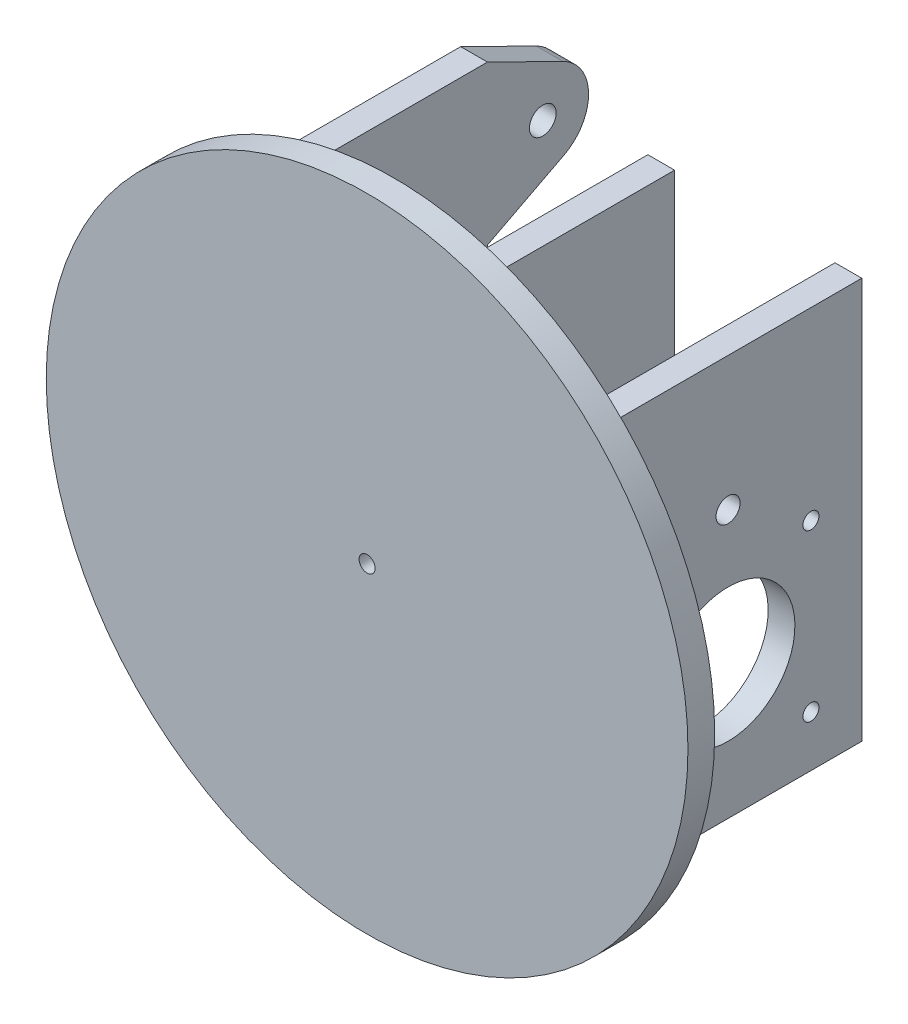
ISO-10303-21;
HEADER;
FILE_DESCRIPTION(('STEP AP214'),'2;1');
FILE_NAME('part.step','',(''),(''),'','','');
FILE_SCHEMA(('AUTOMOTIVE_DESIGN { 1 0 10303 214 1 1 1 1 }'));
ENDSEC;
DATA;
#1=APPLICATION_CONTEXT('core data for automotive mechanical design processes');
#2=APPLICATION_PROTOCOL_DEFINITION('international standard','automotive_design',2000,#1);
#3=PRODUCT_CONTEXT('',#1,'mechanical');
#4=PRODUCT('Part','Part','',(#3));
#5=PRODUCT_RELATED_PRODUCT_CATEGORY('part','',(#4));
#6=PRODUCT_DEFINITION_FORMATION('','',#4);
#7=PRODUCT_DEFINITION_CONTEXT('part definition',#1,'design');
#8=PRODUCT_DEFINITION('design','',#6,#7);
#9=PRODUCT_DEFINITION_SHAPE('','',#8);
#10=(LENGTH_UNIT() NAMED_UNIT(*) SI_UNIT(.MILLI.,.METRE.));
#11=(NAMED_UNIT(*) PLANE_ANGLE_UNIT() SI_UNIT($,.RADIAN.));
#12=(NAMED_UNIT(*) SI_UNIT($,.STERADIAN.) SOLID_ANGLE_UNIT());
#13=UNCERTAINTY_MEASURE_WITH_UNIT(LENGTH_MEASURE(1.E-05),#10,'distance_accuracy_value','');
#14=(GEOMETRIC_REPRESENTATION_CONTEXT(3) GLOBAL_UNCERTAINTY_ASSIGNED_CONTEXT((#13)) GLOBAL_UNIT_ASSIGNED_CONTEXT((#10,
#11,#12)) REPRESENTATION_CONTEXT('',''));
#15=CARTESIAN_POINT('',(0.,0.,0.));
#16=DIRECTION('',(0.,0.,1.));
#17=DIRECTION('',(1.,0.,0.));
#18=AXIS2_PLACEMENT_3D('',#15,#16,#17);
#19=CARTESIAN_POINT('',(0.,0.,-50.));
#20=DIRECTION('',(0.,0.,1.));
#21=DIRECTION('',(1.,0.,0.));
#22=AXIS2_PLACEMENT_3D('',#19,#20,#21);
#23=PLANE('',#22);
#24=DIRECTION('',(-1.,0.,0.));
#25=VECTOR('',#24,1.);
#26=CARTESIAN_POINT('',(-32.5,7.85533905932757,-50.));
#27=LINE('',#26,#25);
#28=CARTESIAN_POINT('',(-32.5,7.85533905932757,-50.));
#29=VERTEX_POINT('',#28);
#30=CARTESIAN_POINT('',(-37.5,7.85533905932756,-50.));
#31=VERTEX_POINT('',#30);
#32=EDGE_CURVE('E57',#29,#31,#27,.T.);
#33=ORIENTED_EDGE('',*,*,#32,.F.);
#34=DIRECTION('',(0.,-1.,0.));
#35=VECTOR('',#34,1.);
#36=CARTESIAN_POINT('',(-32.5,37.5,-50.));
#37=LINE('',#36,#35);
#38=CARTESIAN_POINT('',(-32.5,-37.5,-50.));
#39=VERTEX_POINT('',#38);
#40=EDGE_CURVE('E170',#29,#39,#37,.T.);
#41=ORIENTED_EDGE('',*,*,#40,.T.);
#42=DIRECTION('',(-1.,0.,0.));
#43=VECTOR('',#42,1.);
#44=CARTESIAN_POINT('',(-37.5,-37.5,-50.));
#45=LINE('',#44,#43);
#46=CARTESIAN_POINT('',(-37.5,-37.5,-50.));
#47=VERTEX_POINT('',#46);
#48=EDGE_CURVE('E322',#39,#47,#45,.T.);
#49=ORIENTED_EDGE('',*,*,#48,.T.);
#50=DIRECTION('',(0.,1.,0.));
#51=VECTOR('',#50,1.);
#52=CARTESIAN_POINT('',(-37.5,37.5,-50.));
#53=LINE('',#52,#51);
#54=EDGE_CURVE('E315',#47,#31,#53,.T.);
#55=ORIENTED_EDGE('',*,*,#54,.T.);
#56=EDGE_LOOP('',(#33,#41,#49,#55));
#57=FACE_BOUND('',#56,.T.);
#58=ADVANCED_FACE('F40',(#57),#23,.F.);
#59=CARTESIAN_POINT('',(0.,0.,0.));
#60=DIRECTION('',(0.,0.,1.));
#61=DIRECTION('',(1.,0.,0.));
#62=AXIS2_PLACEMENT_3D('',#59,#60,#61);
#63=PLANE('',#62);
#64=DIRECTION('',(-1.,0.,0.));
#65=VECTOR('',#64,1.);
#66=CARTESIAN_POINT('',(37.5,-37.4999999999999,0.));
#67=LINE('',#66,#65);
#68=CARTESIAN_POINT('',(37.5,-37.4999999999999,0.));
#69=VERTEX_POINT('',#68);
#70=CARTESIAN_POINT('',(32.5,-37.4999999999999,0.));
#71=VERTEX_POINT('',#70);
#72=EDGE_CURVE('E281',#69,#71,#67,.T.);
#73=ORIENTED_EDGE('',*,*,#72,.F.);
#74=DIRECTION('',(0.,-1.,0.));
#75=VECTOR('',#74,1.);
#76=CARTESIAN_POINT('',(37.5,37.5,0.));
#77=LINE('',#76,#75);
#78=CARTESIAN_POINT('',(37.5,37.5,0.));
#79=VERTEX_POINT('',#78);
#80=EDGE_CURVE('E286',#79,#69,#77,.T.);
#81=ORIENTED_EDGE('',*,*,#80,.F.);
#82=DIRECTION('',(1.,0.,0.));
#83=VECTOR('',#82,1.);
#84=CARTESIAN_POINT('',(37.5,37.5,0.));
#85=LINE('',#84,#83);
#86=CARTESIAN_POINT('',(32.5,37.5,0.));
#87=VERTEX_POINT('',#86);
#88=EDGE_CURVE('E298',#87,#79,#85,.T.);
#89=ORIENTED_EDGE('',*,*,#88,.F.);
#90=DIRECTION('',(0.,1.,0.));
#91=VECTOR('',#90,1.);
#92=CARTESIAN_POINT('',(32.5,37.5,0.));
#93=LINE('',#92,#91);
#94=EDGE_CURVE('E295',#71,#87,#93,.T.);
#95=ORIENTED_EDGE('',*,*,#94,.F.);
#96=EDGE_LOOP('',(#73,#81,#89,#95));
#97=FACE_BOUND('',#96,.T.);
#98=CARTESIAN_POINT('',(0.,0.,0.));
#99=DIRECTION('',(0.,0.,1.));
#100=DIRECTION('',(1.,0.,0.));
#101=AXIS2_PLACEMENT_3D('',#98,#99,#100);
#102=CIRCLE('',#101,60.);
#103=CARTESIAN_POINT('',(60.,0.,0.));
#104=VERTEX_POINT('',#103);
#105=EDGE_CURVE('E49',#104,#104,#102,.T.);
#106=ORIENTED_EDGE('',*,*,#105,.F.);
#107=EDGE_LOOP('',(#106));
#108=FACE_BOUND('',#107,.T.);
#109=DIRECTION('',(0.,1.,0.));
#110=VECTOR('',#109,1.);
#111=CARTESIAN_POINT('',(-37.5,37.5,0.));
#112=LINE('',#111,#110);
#113=CARTESIAN_POINT('',(-37.5,-37.5,0.));
#114=VERTEX_POINT('',#113);
#115=CARTESIAN_POINT('',(-37.5,37.5,0.));
#116=VERTEX_POINT('',#115);
#117=EDGE_CURVE('E314',#114,#116,#112,.T.);
#118=ORIENTED_EDGE('',*,*,#117,.F.);
#119=DIRECTION('',(-1.,0.,0.));
#120=VECTOR('',#119,1.);
#121=CARTESIAN_POINT('',(-37.5,-37.5,0.));
#122=LINE('',#121,#120);
#123=CARTESIAN_POINT('',(-32.5,-37.5,0.));
#124=VERTEX_POINT('',#123);
#125=EDGE_CURVE('E318',#124,#114,#122,.T.);
#126=ORIENTED_EDGE('',*,*,#125,.F.);
#127=DIRECTION('',(0.,-1.,0.));
#128=VECTOR('',#127,1.);
#129=CARTESIAN_POINT('',(-32.5,37.5,0.));
#130=LINE('',#129,#128);
#131=CARTESIAN_POINT('',(-32.5,37.5,0.));
#132=VERTEX_POINT('',#131);
#133=EDGE_CURVE('E330',#132,#124,#130,.T.);
#134=ORIENTED_EDGE('',*,*,#133,.F.);
#135=DIRECTION('',(1.,0.,0.));
#136=VECTOR('',#135,1.);
#137=CARTESIAN_POINT('',(-37.5,37.5,0.));
#138=LINE('',#137,#136);
#139=EDGE_CURVE('E327',#116,#132,#138,.T.);
#140=ORIENTED_EDGE('',*,*,#139,.F.);
#141=EDGE_LOOP('',(#118,#126,#134,#140));
#142=FACE_BOUND('',#141,.T.);
#143=DIRECTION('',(0.,1.,0.));
#144=VECTOR('',#143,1.);
#145=CARTESIAN_POINT('',(-2.50000000000001,-37.5,0.));
#146=LINE('',#145,#144);
#147=CARTESIAN_POINT('',(-2.50000000000001,-37.5,0.));
#148=VERTEX_POINT('',#147);
#149=CARTESIAN_POINT('',(-2.50000000000001,37.5,0.));
#150=VERTEX_POINT('',#149);
#151=EDGE_CURVE('E261',#148,#150,#146,.T.);
#152=ORIENTED_EDGE('',*,*,#151,.F.);
#153=DIRECTION('',(-1.,0.,0.));
#154=VECTOR('',#153,1.);
#155=CARTESIAN_POINT('',(2.49999999999999,-37.5,0.));
#156=LINE('',#155,#154);
#157=CARTESIAN_POINT('',(2.49999999999999,-37.5,0.));
#158=VERTEX_POINT('',#157);
#159=EDGE_CURVE('E254',#158,#148,#156,.T.);
#160=ORIENTED_EDGE('',*,*,#159,.F.);
#161=DIRECTION('',(0.,-1.,0.));
#162=VECTOR('',#161,1.);
#163=CARTESIAN_POINT('',(2.49999999999999,-37.5,0.));
#164=LINE('',#163,#162);
#165=CARTESIAN_POINT('',(2.49999999999999,37.5,0.));
#166=VERTEX_POINT('',#165);
#167=EDGE_CURVE('E266',#166,#158,#164,.T.);
#168=ORIENTED_EDGE('',*,*,#167,.F.);
#169=DIRECTION('',(1.,0.,0.));
#170=VECTOR('',#169,1.);
#171=CARTESIAN_POINT('',(2.49999999999999,37.5,0.));
#172=LINE('',#171,#170);
#173=EDGE_CURVE('E65',#150,#166,#172,.T.);
#174=ORIENTED_EDGE('',*,*,#173,.F.);
#175=EDGE_LOOP('',(#152,#160,#168,#174));
#176=FACE_BOUND('',#175,.T.);
#177=ADVANCED_FACE('F388',(#97,#108,#142,#176),#63,.F.);
#178=CARTESIAN_POINT('',(0.,0.,5.));
#179=DIRECTION('',(0.,0.,1.));
#180=DIRECTION('',(1.,0.,0.));
#181=AXIS2_PLACEMENT_3D('',#178,#179,#180);
#182=PLANE('',#181);
#183=CARTESIAN_POINT('',(0.,0.,5.));
#184=DIRECTION('',(0.,0.,1.));
#185=DIRECTION('',(1.,0.,0.));
#186=AXIS2_PLACEMENT_3D('',#183,#184,#185);
#187=CIRCLE('',#186,60.);
#188=CARTESIAN_POINT('',(60.,0.,5.));
#189=VERTEX_POINT('',#188);
#190=EDGE_CURVE('E11',#189,#189,#187,.T.);
#191=ORIENTED_EDGE('',*,*,#190,.T.);
#192=EDGE_LOOP('',(#191));
#193=FACE_BOUND('',#192,.T.);
#194=CARTESIAN_POINT('',(0.,0.,5.));
#195=DIRECTION('',(0.,0.,1.));
#196=DIRECTION('',(1.,0.,0.));
#197=AXIS2_PLACEMENT_3D('',#194,#195,#196);
#198=CIRCLE('',#197,1.5);
#199=CARTESIAN_POINT('',(1.5,0.,5.));
#200=VERTEX_POINT('',#199);
#201=EDGE_CURVE('E346',#200,#200,#198,.T.);
#202=ORIENTED_EDGE('',*,*,#201,.F.);
#203=EDGE_LOOP('',(#202));
#204=FACE_BOUND('',#203,.T.);
#205=ADVANCED_FACE('F393',(#193,#204),#182,.T.);
#206=CARTESIAN_POINT('',(0.,0.,5.));
#207=DIRECTION('',(0.,0.,-1.));
#208=DIRECTION('',(-1.,0.,0.));
#209=AXIS2_PLACEMENT_3D('',#206,#207,#208);
#210=CYLINDRICAL_SURFACE('',#209,60.);
#211=ORIENTED_EDGE('',*,*,#190,.F.);
#212=EDGE_LOOP('',(#211));
#213=FACE_BOUND('',#212,.T.);
#214=ORIENTED_EDGE('',*,*,#105,.T.);
#215=EDGE_LOOP('',(#214));
#216=FACE_BOUND('',#215,.T.);
#217=ADVANCED_FACE('F42',(#213,#216),#210,.T.);
#218=CARTESIAN_POINT('',(0.,0.,5.));
#219=DIRECTION('',(0.,0.,-1.));
#220=DIRECTION('',(-1.,0.,0.));
#221=AXIS2_PLACEMENT_3D('',#218,#219,#220);
#222=CYLINDRICAL_SURFACE('',#221,1.5);
#223=ORIENTED_EDGE('',*,*,#201,.T.);
#224=EDGE_LOOP('',(#223));
#225=FACE_BOUND('',#224,.T.);
#226=CARTESIAN_POINT('',(0.,0.,0.));
#227=DIRECTION('',(0.,0.,1.));
#228=DIRECTION('',(1.,0.,0.));
#229=AXIS2_PLACEMENT_3D('',#226,#227,#228);
#230=CIRCLE('',#229,1.5);
#231=CARTESIAN_POINT('',(1.5,0.,0.));
#232=VERTEX_POINT('',#231);
#233=EDGE_CURVE('E345',#232,#232,#230,.T.);
#234=ORIENTED_EDGE('',*,*,#233,.F.);
#235=EDGE_LOOP('',(#234));
#236=FACE_BOUND('',#235,.T.);
#237=ADVANCED_FACE('F413',(#225,#236),#222,.F.);
#238=CARTESIAN_POINT('',(-37.5,37.5,-50.));
#239=DIRECTION('',(1.,0.,0.));
#240=DIRECTION('',(0.,1.,0.));
#241=AXIS2_PLACEMENT_3D('',#238,#239,#240);
#242=PLANE('',#241);
#243=CARTESIAN_POINT('',(-37.5,3.,-40.5));
#244=DIRECTION('',(-1.,0.,0.));
#245=DIRECTION('',(0.,-1.,0.));
#246=AXIS2_PLACEMENT_3D('',#243,#244,#245);
#247=CIRCLE('',#246,1.5);
#248=CARTESIAN_POINT('',(-37.5,1.50000000000001,-40.5));
#249=VERTEX_POINT('',#248);
#250=EDGE_CURVE('E202',#249,#249,#247,.T.);
#251=ORIENTED_EDGE('',*,*,#250,.F.);
#252=EDGE_LOOP('',(#251));
#253=FACE_BOUND('',#252,.T.);
#254=CARTESIAN_POINT('',(-37.5,-28.,-9.50000000000002));
#255=DIRECTION('',(-1.,0.,0.));
#256=DIRECTION('',(0.,-1.,0.));
#257=AXIS2_PLACEMENT_3D('',#254,#255,#256);
#258=CIRCLE('',#257,1.50000000000009);
#259=CARTESIAN_POINT('',(-37.5,-29.5000000000001,-9.50000000000002));
#260=VERTEX_POINT('',#259);
#261=EDGE_CURVE('E197',#260,#260,#258,.T.);
#262=ORIENTED_EDGE('',*,*,#261,.F.);
#263=EDGE_LOOP('',(#262));
#264=FACE_BOUND('',#263,.T.);
#265=CARTESIAN_POINT('',(-37.5,-28.,-40.5));
#266=DIRECTION('',(-1.,0.,0.));
#267=DIRECTION('',(0.,-1.,0.));
#268=AXIS2_PLACEMENT_3D('',#265,#266,#267);
#269=CIRCLE('',#268,1.50000000000008);
#270=CARTESIAN_POINT('',(-37.5,-29.5000000000001,-40.5));
#271=VERTEX_POINT('',#270);
#272=EDGE_CURVE('E190',#271,#271,#269,.T.);
#273=ORIENTED_EDGE('',*,*,#272,.F.);
#274=EDGE_LOOP('',(#273));
#275=FACE_BOUND('',#274,.T.);
#276=CARTESIAN_POINT('',(-37.5,-12.5,-25.));
#277=DIRECTION('',(-1.,0.,0.));
#278=DIRECTION('',(0.,-1.,0.));
#279=AXIS2_PLACEMENT_3D('',#276,#277,#278);
#280=CIRCLE('',#279,12.5);
#281=CARTESIAN_POINT('',(-37.5,-25.,-25.));
#282=VERTEX_POINT('',#281);
#283=EDGE_CURVE('E188',#282,#282,#280,.T.);
#284=ORIENTED_EDGE('',*,*,#283,.F.);
#285=EDGE_LOOP('',(#284));
#286=FACE_BOUND('',#285,.T.);
#287=CARTESIAN_POINT('',(-37.5,3.,-9.50000000000002));
#288=DIRECTION('',(-1.,0.,0.));
#289=DIRECTION('',(0.,-1.,0.));
#290=AXIS2_PLACEMENT_3D('',#287,#288,#289);
#291=CIRCLE('',#290,1.5);
#292=CARTESIAN_POINT('',(-37.5,1.5,-9.50000000000002));
#293=VERTEX_POINT('',#292);
#294=EDGE_CURVE('E209',#293,#293,#291,.T.);
#295=ORIENTED_EDGE('',*,*,#294,.F.);
#296=EDGE_LOOP('',(#295));
#297=FACE_BOUND('',#296,.T.);
#298=CARTESIAN_POINT('',(-37.5,12.5,-25.));
#299=DIRECTION('',(1.,0.,0.));
#300=DIRECTION('',(0.,1.,0.));
#301=AXIS2_PLACEMENT_3D('',#298,#299,#300);
#302=CIRCLE('',#301,2.24506403026729);
#303=CARTESIAN_POINT('',(-37.5,14.7450640302673,-25.));
#304=VERTEX_POINT('',#303);
#305=EDGE_CURVE('E231',#304,#304,#302,.F.);
#306=ORIENTED_EDGE('',*,*,#305,.F.);
#307=EDGE_LOOP('',(#306));
#308=FACE_BOUND('',#307,.T.);
#309=ORIENTED_EDGE('',*,*,#117,.T.);
#310=DIRECTION('',(0.,0.,1.));
#311=VECTOR('',#310,1.);
#312=CARTESIAN_POINT('',(-37.5,37.5,-50.));
#313=LINE('',#312,#311);
#314=CARTESIAN_POINT('',(-37.5,37.5,-50.));
#315=VERTEX_POINT('',#314);
#316=EDGE_CURVE('E342',#315,#116,#313,.T.);
#317=ORIENTED_EDGE('',*,*,#316,.F.);
#318=DIRECTION('',(0.,-0.441927974013622,-0.897050536917634));
#319=VECTOR('',#318,1.);
#320=CARTESIAN_POINT('',(-37.5,37.5,-50.));
#321=LINE('',#320,#319);
#322=CARTESIAN_POINT('',(-37.5,30.5347078833964,-64.1385460989053));
#323=VERTEX_POINT('',#322);
#324=EDGE_CURVE('E174',#315,#323,#321,.T.);
#325=ORIENTED_EDGE('',*,*,#324,.T.);
#326=CARTESIAN_POINT('',(-37.5,22.8553390593276,-60.3553390593272));
#327=DIRECTION('',(-1.,0.,0.));
#328=DIRECTION('',(0.,1.,0.));
#329=AXIS2_PLACEMENT_3D('',#326,#327,#328);
#330=CIRCLE('',#329,8.5606869490943);
#331=CARTESIAN_POINT('',(-37.5,15.2528322543587,-64.2907235793959));
#332=VERTEX_POINT('',#331);
#333=EDGE_CURVE('E183',#323,#332,#330,.T.);
#334=ORIENTED_EDGE('',*,*,#333,.T.);
#335=DIRECTION('',(0.,-0.459704290493304,0.888072049611994));
#336=VECTOR('',#335,1.);
#337=CARTESIAN_POINT('',(-37.5,15.2528322543587,-64.2907235793959));
#338=LINE('',#337,#336);
#339=EDGE_CURVE('E154',#332,#31,#338,.T.);
#340=ORIENTED_EDGE('',*,*,#339,.T.);
#341=ORIENTED_EDGE('',*,*,#54,.F.);
#342=DIRECTION('',(0.,0.,1.));
#343=VECTOR('',#342,1.);
#344=CARTESIAN_POINT('',(-37.5,-37.5,-50.));
#345=LINE('',#344,#343);
#346=EDGE_CURVE('E324',#47,#114,#345,.T.);
#347=ORIENTED_EDGE('',*,*,#346,.T.);
#348=EDGE_LOOP('',(#309,#317,#325,#334,#340,#341,#347));
#349=FACE_BOUND('',#348,.T.);
#350=CARTESIAN_POINT('',(-37.5,22.8553390593276,-60.3553390593272));
#351=DIRECTION('',(-1.,0.,0.));
#352=DIRECTION('',(0.,-1.,0.));
#353=AXIS2_PLACEMENT_3D('',#350,#351,#352);
#354=CIRCLE('',#353,2.5);
#355=CARTESIAN_POINT('',(-37.5,20.3553390593276,-60.3553390593272));
#356=VERTEX_POINT('',#355);
#357=EDGE_CURVE('E179',#356,#356,#354,.T.);
#358=ORIENTED_EDGE('',*,*,#357,.F.);
#359=EDGE_LOOP('',(#358));
#360=FACE_BOUND('',#359,.T.);
#361=ADVANCED_FACE('F409',(#253,#264,#275,#286,#297,#308,#349,#360),#242,.F.);
#362=CARTESIAN_POINT('',(-37.5,37.5,-50.));
#363=DIRECTION('',(0.,-1.,0.));
#364=DIRECTION('',(0.,0.,-1.));
#365=AXIS2_PLACEMENT_3D('',#362,#363,#364);
#366=PLANE('',#365);
#367=ORIENTED_EDGE('',*,*,#139,.T.);
#368=DIRECTION('',(0.,0.,1.));
#369=VECTOR('',#368,1.);
#370=CARTESIAN_POINT('',(-32.5,37.5,-50.));
#371=LINE('',#370,#369);
#372=CARTESIAN_POINT('',(-32.5,37.5,-50.));
#373=VERTEX_POINT('',#372);
#374=EDGE_CURVE('E339',#373,#132,#371,.T.);
#375=ORIENTED_EDGE('',*,*,#374,.F.);
#376=DIRECTION('',(1.,0.,0.));
#377=VECTOR('',#376,1.);
#378=CARTESIAN_POINT('',(-37.5,37.5,-50.));
#379=LINE('',#378,#377);
#380=EDGE_CURVE('E317',#315,#373,#379,.T.);
#381=ORIENTED_EDGE('',*,*,#380,.F.);
#382=ORIENTED_EDGE('',*,*,#316,.T.);
#383=EDGE_LOOP('',(#367,#375,#381,#382));
#384=FACE_BOUND('',#383,.T.);
#385=ADVANCED_FACE('F405',(#384),#366,.F.);
#386=CARTESIAN_POINT('',(-32.5,37.5,-50.));
#387=DIRECTION('',(-1.,0.,0.));
#388=DIRECTION('',(0.,-1.,0.));
#389=AXIS2_PLACEMENT_3D('',#386,#387,#388);
#390=PLANE('',#389);
#391=CARTESIAN_POINT('',(-32.5,3.00000000000001,-40.5));
#392=DIRECTION('',(-1.,0.,0.));
#393=DIRECTION('',(0.,-1.,0.));
#394=AXIS2_PLACEMENT_3D('',#391,#392,#393);
#395=CIRCLE('',#394,1.5);
#396=CARTESIAN_POINT('',(-32.5,1.50000000000001,-40.5));
#397=VERTEX_POINT('',#396);
#398=EDGE_CURVE('E205',#397,#397,#395,.F.);
#399=ORIENTED_EDGE('',*,*,#398,.F.);
#400=EDGE_LOOP('',(#399));
#401=FACE_BOUND('',#400,.T.);
#402=CARTESIAN_POINT('',(-32.5,-28.,-9.50000000000002));
#403=DIRECTION('',(-1.,0.,0.));
#404=DIRECTION('',(0.,-1.,0.));
#405=AXIS2_PLACEMENT_3D('',#402,#403,#404);
#406=CIRCLE('',#405,1.50000000000009);
#407=CARTESIAN_POINT('',(-32.5,-29.5000000000001,-9.50000000000002));
#408=VERTEX_POINT('',#407);
#409=EDGE_CURVE('E206',#408,#408,#406,.F.);
#410=ORIENTED_EDGE('',*,*,#409,.F.);
#411=EDGE_LOOP('',(#410));
#412=FACE_BOUND('',#411,.T.);
#413=CARTESIAN_POINT('',(-32.5,-28.,-40.5));
#414=DIRECTION('',(-1.,0.,0.));
#415=DIRECTION('',(0.,-1.,0.));
#416=AXIS2_PLACEMENT_3D('',#413,#414,#415);
#417=CIRCLE('',#416,1.50000000000008);
#418=CARTESIAN_POINT('',(-32.5,-29.5000000000001,-40.5));
#419=VERTEX_POINT('',#418);
#420=EDGE_CURVE('E193',#419,#419,#417,.F.);
#421=ORIENTED_EDGE('',*,*,#420,.F.);
#422=EDGE_LOOP('',(#421));
#423=FACE_BOUND('',#422,.T.);
#424=CARTESIAN_POINT('',(-32.5,-12.5,-25.));
#425=DIRECTION('',(-1.,0.,0.));
#426=DIRECTION('',(0.,-1.,0.));
#427=AXIS2_PLACEMENT_3D('',#424,#425,#426);
#428=CIRCLE('',#427,12.5);
#429=CARTESIAN_POINT('',(-32.5,-25.,-25.));
#430=VERTEX_POINT('',#429);
#431=EDGE_CURVE('E194',#430,#430,#428,.F.);
#432=ORIENTED_EDGE('',*,*,#431,.F.);
#433=EDGE_LOOP('',(#432));
#434=FACE_BOUND('',#433,.T.);
#435=CARTESIAN_POINT('',(-32.5,3.00000000000001,-9.50000000000002));
#436=DIRECTION('',(-1.,0.,0.));
#437=DIRECTION('',(0.,-1.,0.));
#438=AXIS2_PLACEMENT_3D('',#435,#436,#437);
#439=CIRCLE('',#438,1.5);
#440=CARTESIAN_POINT('',(-32.5,1.50000000000001,-9.50000000000002));
#441=VERTEX_POINT('',#440);
#442=EDGE_CURVE('E216',#441,#441,#439,.F.);
#443=ORIENTED_EDGE('',*,*,#442,.F.);
#444=EDGE_LOOP('',(#443));
#445=FACE_BOUND('',#444,.T.);
#446=CARTESIAN_POINT('',(-32.5,12.5,-25.));
#447=DIRECTION('',(-1.,0.,0.));
#448=DIRECTION('',(0.,-1.,0.));
#449=AXIS2_PLACEMENT_3D('',#446,#447,#448);
#450=CIRCLE('',#449,2.24506403026729);
#451=CARTESIAN_POINT('',(-32.5,10.2549359697327,-25.));
#452=VERTEX_POINT('',#451);
#453=EDGE_CURVE('E228',#452,#452,#450,.F.);
#454=ORIENTED_EDGE('',*,*,#453,.F.);
#455=EDGE_LOOP('',(#454));
#456=FACE_BOUND('',#455,.T.);
#457=ORIENTED_EDGE('',*,*,#133,.T.);
#458=DIRECTION('',(0.,0.,1.));
#459=VECTOR('',#458,1.);
#460=CARTESIAN_POINT('',(-32.5,-37.5,-50.));
#461=LINE('',#460,#459);
#462=EDGE_CURVE('E336',#39,#124,#461,.T.);
#463=ORIENTED_EDGE('',*,*,#462,.F.);
#464=ORIENTED_EDGE('',*,*,#40,.F.);
#465=DIRECTION('',(0.,-0.459704290493304,0.888072049611994));
#466=VECTOR('',#465,1.);
#467=CARTESIAN_POINT('',(-32.5,15.2528322543587,-64.2907235793959));
#468=LINE('',#467,#466);
#469=CARTESIAN_POINT('',(-32.5,15.2528322543587,-64.2907235793959));
#470=VERTEX_POINT('',#469);
#471=EDGE_CURVE('E152',#470,#29,#468,.T.);
#472=ORIENTED_EDGE('',*,*,#471,.F.);
#473=CARTESIAN_POINT('',(-32.5,22.8553390593276,-60.3553390593272));
#474=DIRECTION('',(-1.,0.,0.));
#475=DIRECTION('',(0.,1.,0.));
#476=AXIS2_PLACEMENT_3D('',#473,#474,#475);
#477=CIRCLE('',#476,8.5606869490943);
#478=CARTESIAN_POINT('',(-32.5,30.5347078833964,-64.1385460989053));
#479=VERTEX_POINT('',#478);
#480=EDGE_CURVE('E167',#479,#470,#477,.T.);
#481=ORIENTED_EDGE('',*,*,#480,.F.);
#482=DIRECTION('',(0.,-0.441927974013622,-0.897050536917634));
#483=VECTOR('',#482,1.);
#484=CARTESIAN_POINT('',(-32.5,37.5,-50.));
#485=LINE('',#484,#483);
#486=EDGE_CURVE('E159',#373,#479,#485,.T.);
#487=ORIENTED_EDGE('',*,*,#486,.F.);
#488=ORIENTED_EDGE('',*,*,#374,.T.);
#489=EDGE_LOOP('',(#457,#463,#464,#472,#481,#487,#488));
#490=FACE_BOUND('',#489,.T.);
#491=CARTESIAN_POINT('',(-32.5,22.8553390593276,-60.3553390593272));
#492=DIRECTION('',(-1.,0.,0.));
#493=DIRECTION('',(0.,-1.,0.));
#494=AXIS2_PLACEMENT_3D('',#491,#492,#493);
#495=CIRCLE('',#494,2.5);
#496=CARTESIAN_POINT('',(-32.5,20.3553390593276,-60.3553390593272));
#497=VERTEX_POINT('',#496);
#498=EDGE_CURVE('E185',#497,#497,#495,.T.);
#499=ORIENTED_EDGE('',*,*,#498,.T.);
#500=EDGE_LOOP('',(#499));
#501=FACE_BOUND('',#500,.T.);
#502=ADVANCED_FACE('F164',(#401,#412,#423,#434,#445,#456,#490,#501),#390,.F.);
#503=CARTESIAN_POINT('',(-37.5,-37.5,-50.));
#504=DIRECTION('',(0.,1.,0.));
#505=DIRECTION('',(0.,0.,1.));
#506=AXIS2_PLACEMENT_3D('',#503,#504,#505);
#507=PLANE('',#506);
#508=ORIENTED_EDGE('',*,*,#125,.T.);
#509=ORIENTED_EDGE('',*,*,#346,.F.);
#510=ORIENTED_EDGE('',*,*,#48,.F.);
#511=ORIENTED_EDGE('',*,*,#462,.T.);
#512=EDGE_LOOP('',(#508,#509,#510,#511));
#513=FACE_BOUND('',#512,.T.);
#514=ADVANCED_FACE('F399',(#513),#507,.F.);
#515=CARTESIAN_POINT('',(37.5,-37.4999999999999,-50.));
#516=DIRECTION('',(0.,1.,0.));
#517=DIRECTION('',(0.,0.,1.));
#518=AXIS2_PLACEMENT_3D('',#515,#516,#517);
#519=PLANE('',#518);
#520=ORIENTED_EDGE('',*,*,#72,.T.);
#521=DIRECTION('',(0.,0.,1.));
#522=VECTOR('',#521,1.);
#523=CARTESIAN_POINT('',(32.5,-37.4999999999999,-50.));
#524=LINE('',#523,#522);
#525=CARTESIAN_POINT('',(32.5,-37.4999999999999,-50.));
#526=VERTEX_POINT('',#525);
#527=EDGE_CURVE('E311',#526,#71,#524,.T.);
#528=ORIENTED_EDGE('',*,*,#527,.F.);
#529=DIRECTION('',(-1.,0.,0.));
#530=VECTOR('',#529,1.);
#531=CARTESIAN_POINT('',(37.5,-37.4999999999999,-50.));
#532=LINE('',#531,#530);
#533=CARTESIAN_POINT('',(37.5,-37.4999999999999,-50.));
#534=VERTEX_POINT('',#533);
#535=EDGE_CURVE('E282',#534,#526,#532,.T.);
#536=ORIENTED_EDGE('',*,*,#535,.F.);
#537=DIRECTION('',(0.,0.,1.));
#538=VECTOR('',#537,1.);
#539=CARTESIAN_POINT('',(37.5,-37.4999999999999,-50.));
#540=LINE('',#539,#538);
#541=EDGE_CURVE('E292',#534,#69,#540,.T.);
#542=ORIENTED_EDGE('',*,*,#541,.T.);
#543=EDGE_LOOP('',(#520,#528,#536,#542));
#544=FACE_BOUND('',#543,.T.);
#545=ADVANCED_FACE('F397',(#544),#519,.F.);
#546=CARTESIAN_POINT('',(32.5,37.5,-50.));
#547=DIRECTION('',(1.,0.,0.));
#548=DIRECTION('',(0.,1.,0.));
#549=AXIS2_PLACEMENT_3D('',#546,#547,#548);
#550=PLANE('',#549);
#551=CARTESIAN_POINT('',(32.5,12.5,-25.));
#552=DIRECTION('',(1.,0.,0.));
#553=DIRECTION('',(0.,1.,0.));
#554=AXIS2_PLACEMENT_3D('',#551,#552,#553);
#555=CIRCLE('',#554,2.24506403026729);
#556=CARTESIAN_POINT('',(32.5,14.7450640302673,-25.));
#557=VERTEX_POINT('',#556);
#558=EDGE_CURVE('E225',#557,#557,#555,.F.);
#559=ORIENTED_EDGE('',*,*,#558,.F.);
#560=EDGE_LOOP('',(#559));
#561=FACE_BOUND('',#560,.T.);
#562=CARTESIAN_POINT('',(32.5,3.00000000000024,-40.5));
#563=DIRECTION('',(-1.,0.,0.));
#564=DIRECTION('',(0.,-1.,0.));
#565=AXIS2_PLACEMENT_3D('',#562,#563,#564);
#566=CIRCLE('',#565,1.5);
#567=CARTESIAN_POINT('',(32.5,1.50000000000024,-40.5));
#568=VERTEX_POINT('',#567);
#569=EDGE_CURVE('E241',#568,#568,#566,.T.);
#570=ORIENTED_EDGE('',*,*,#569,.F.);
#571=EDGE_LOOP('',(#570));
#572=FACE_BOUND('',#571,.T.);
#573=CARTESIAN_POINT('',(32.5,-27.9999999999997,-9.50000000000007));
#574=DIRECTION('',(-1.,0.,0.));
#575=DIRECTION('',(0.,-1.,0.));
#576=AXIS2_PLACEMENT_3D('',#573,#574,#575);
#577=CIRCLE('',#576,1.50000000000009);
#578=CARTESIAN_POINT('',(32.5,-29.4999999999998,-9.50000000000007));
#579=VERTEX_POINT('',#578);
#580=EDGE_CURVE('E238',#579,#579,#577,.T.);
#581=ORIENTED_EDGE('',*,*,#580,.F.);
#582=EDGE_LOOP('',(#581));
#583=FACE_BOUND('',#582,.T.);
#584=CARTESIAN_POINT('',(32.5,-27.9999999999999,-40.5000000000001));
#585=DIRECTION('',(-1.,0.,0.));
#586=DIRECTION('',(0.,-1.,0.));
#587=AXIS2_PLACEMENT_3D('',#584,#585,#586);
#588=CIRCLE('',#587,1.50000000000009);
#589=CARTESIAN_POINT('',(32.5,-29.5,-40.5000000000001));
#590=VERTEX_POINT('',#589);
#591=EDGE_CURVE('E235',#590,#590,#588,.T.);
#592=ORIENTED_EDGE('',*,*,#591,.F.);
#593=EDGE_LOOP('',(#592));
#594=FACE_BOUND('',#593,.T.);
#595=CARTESIAN_POINT('',(32.5,-12.4999999999998,-24.9999999999999));
#596=DIRECTION('',(-1.,0.,0.));
#597=DIRECTION('',(0.,-1.,0.));
#598=AXIS2_PLACEMENT_3D('',#595,#596,#597);
#599=CIRCLE('',#598,12.5);
#600=CARTESIAN_POINT('',(32.5,-24.9999999999998,-24.9999999999999));
#601=VERTEX_POINT('',#600);
#602=EDGE_CURVE('E234',#601,#601,#599,.T.);
#603=ORIENTED_EDGE('',*,*,#602,.F.);
#604=EDGE_LOOP('',(#603));
#605=FACE_BOUND('',#604,.T.);
#606=CARTESIAN_POINT('',(32.5,3.00000000000024,-9.49999999999999));
#607=DIRECTION('',(-1.,0.,0.));
#608=DIRECTION('',(0.,-1.,0.));
#609=AXIS2_PLACEMENT_3D('',#606,#607,#608);
#610=CIRCLE('',#609,1.5);
#611=CARTESIAN_POINT('',(32.5,1.50000000000024,-9.49999999999999));
#612=VERTEX_POINT('',#611);
#613=EDGE_CURVE('E244',#612,#612,#610,.T.);
#614=ORIENTED_EDGE('',*,*,#613,.F.);
#615=EDGE_LOOP('',(#614));
#616=FACE_BOUND('',#615,.T.);
#617=ORIENTED_EDGE('',*,*,#94,.T.);
#618=DIRECTION('',(0.,0.,1.));
#619=VECTOR('',#618,1.);
#620=CARTESIAN_POINT('',(32.5,37.5,-50.));
#621=LINE('',#620,#619);
#622=CARTESIAN_POINT('',(32.5,37.5,-50.));
#623=VERTEX_POINT('',#622);
#624=EDGE_CURVE('E308',#623,#87,#621,.T.);
#625=ORIENTED_EDGE('',*,*,#624,.F.);
#626=DIRECTION('',(0.,1.,0.));
#627=VECTOR('',#626,1.);
#628=CARTESIAN_POINT('',(32.5,37.5,-50.));
#629=LINE('',#628,#627);
#630=EDGE_CURVE('E285',#526,#623,#629,.T.);
#631=ORIENTED_EDGE('',*,*,#630,.F.);
#632=ORIENTED_EDGE('',*,*,#527,.T.);
#633=EDGE_LOOP('',(#617,#625,#631,#632));
#634=FACE_BOUND('',#633,.T.);
#635=ADVANCED_FACE('F464',(#561,#572,#583,#594,#605,#616,#634),#550,.F.);
#636=CARTESIAN_POINT('',(37.5,37.5,-50.));
#637=DIRECTION('',(0.,-1.,0.));
#638=DIRECTION('',(0.,0.,-1.));
#639=AXIS2_PLACEMENT_3D('',#636,#637,#638);
#640=PLANE('',#639);
#641=ORIENTED_EDGE('',*,*,#88,.T.);
#642=DIRECTION('',(0.,0.,1.));
#643=VECTOR('',#642,1.);
#644=CARTESIAN_POINT('',(37.5,37.5,-50.));
#645=LINE('',#644,#643);
#646=CARTESIAN_POINT('',(37.5,37.5,-50.));
#647=VERTEX_POINT('',#646);
#648=EDGE_CURVE('E305',#647,#79,#645,.T.);
#649=ORIENTED_EDGE('',*,*,#648,.F.);
#650=DIRECTION('',(1.,0.,0.));
#651=VECTOR('',#650,1.);
#652=CARTESIAN_POINT('',(37.5,37.5,-50.));
#653=LINE('',#652,#651);
#654=EDGE_CURVE('E288',#623,#647,#653,.T.);
#655=ORIENTED_EDGE('',*,*,#654,.F.);
#656=ORIENTED_EDGE('',*,*,#624,.T.);
#657=EDGE_LOOP('',(#641,#649,#655,#656));
#658=FACE_BOUND('',#657,.T.);
#659=ADVANCED_FACE('F461',(#658),#640,.F.);
#660=CARTESIAN_POINT('',(37.5,37.5,-50.));
#661=DIRECTION('',(-1.,0.,0.));
#662=DIRECTION('',(0.,-1.,0.));
#663=AXIS2_PLACEMENT_3D('',#660,#661,#662);
#664=PLANE('',#663);
#665=CARTESIAN_POINT('',(37.5,12.5,-25.));
#666=DIRECTION('',(-1.,0.,0.));
#667=DIRECTION('',(0.,-1.,0.));
#668=AXIS2_PLACEMENT_3D('',#665,#666,#667);
#669=CIRCLE('',#668,2.24506403026729);
#670=CARTESIAN_POINT('',(37.5,10.2549359697327,-25.));
#671=VERTEX_POINT('',#670);
#672=EDGE_CURVE('E222',#671,#671,#669,.F.);
#673=ORIENTED_EDGE('',*,*,#672,.F.);
#674=EDGE_LOOP('',(#673));
#675=FACE_BOUND('',#674,.T.);
#676=CARTESIAN_POINT('',(37.5,3.00000000000024,-40.5));
#677=DIRECTION('',(-1.,0.,0.));
#678=DIRECTION('',(0.,-1.,0.));
#679=AXIS2_PLACEMENT_3D('',#676,#677,#678);
#680=CIRCLE('',#679,1.5);
#681=CARTESIAN_POINT('',(37.5,1.50000000000024,-40.5));
#682=VERTEX_POINT('',#681);
#683=EDGE_CURVE('E264',#682,#682,#680,.T.);
#684=ORIENTED_EDGE('',*,*,#683,.T.);
#685=EDGE_LOOP('',(#684));
#686=FACE_BOUND('',#685,.T.);
#687=CARTESIAN_POINT('',(37.5,-27.9999999999997,-9.50000000000007));
#688=DIRECTION('',(-1.,0.,0.));
#689=DIRECTION('',(0.,-1.,0.));
#690=AXIS2_PLACEMENT_3D('',#687,#688,#689);
#691=CIRCLE('',#690,1.50000000000009);
#692=CARTESIAN_POINT('',(37.5,-29.4999999999998,-9.50000000000007));
#693=VERTEX_POINT('',#692);
#694=EDGE_CURVE('E361',#693,#693,#691,.T.);
#695=ORIENTED_EDGE('',*,*,#694,.T.);
#696=EDGE_LOOP('',(#695));
#697=FACE_BOUND('',#696,.T.);
#698=CARTESIAN_POINT('',(37.5,-27.9999999999999,-40.5000000000001));
#699=DIRECTION('',(-1.,0.,0.));
#700=DIRECTION('',(0.,-1.,0.));
#701=AXIS2_PLACEMENT_3D('',#698,#699,#700);
#702=CIRCLE('',#701,1.50000000000009);
#703=CARTESIAN_POINT('',(37.5,-29.5,-40.5000000000001));
#704=VERTEX_POINT('',#703);
#705=EDGE_CURVE('E358',#704,#704,#702,.T.);
#706=ORIENTED_EDGE('',*,*,#705,.T.);
#707=EDGE_LOOP('',(#706));
#708=FACE_BOUND('',#707,.T.);
#709=CARTESIAN_POINT('',(37.5,-12.4999999999998,-24.9999999999999));
#710=DIRECTION('',(-1.,0.,0.));
#711=DIRECTION('',(0.,-1.,0.));
#712=AXIS2_PLACEMENT_3D('',#709,#710,#711);
#713=CIRCLE('',#712,12.5);
#714=CARTESIAN_POINT('',(37.5,-24.9999999999998,-24.9999999999999));
#715=VERTEX_POINT('',#714);
#716=EDGE_CURVE('E355',#715,#715,#713,.T.);
#717=ORIENTED_EDGE('',*,*,#716,.T.);
#718=EDGE_LOOP('',(#717));
#719=FACE_BOUND('',#718,.T.);
#720=CARTESIAN_POINT('',(37.5,3.00000000000024,-9.49999999999999));
#721=DIRECTION('',(-1.,0.,0.));
#722=DIRECTION('',(0.,-1.,0.));
#723=AXIS2_PLACEMENT_3D('',#720,#721,#722);
#724=CIRCLE('',#723,1.5);
#725=CARTESIAN_POINT('',(37.5,1.50000000000024,-9.49999999999999));
#726=VERTEX_POINT('',#725);
#727=EDGE_CURVE('E249',#726,#726,#724,.T.);
#728=ORIENTED_EDGE('',*,*,#727,.T.);
#729=EDGE_LOOP('',(#728));
#730=FACE_BOUND('',#729,.T.);
#731=ORIENTED_EDGE('',*,*,#80,.T.);
#732=ORIENTED_EDGE('',*,*,#541,.F.);
#733=DIRECTION('',(0.,-1.,0.));
#734=VECTOR('',#733,1.);
#735=CARTESIAN_POINT('',(37.5,37.5,-50.));
#736=LINE('',#735,#734);
#737=EDGE_CURVE('E290',#647,#534,#736,.T.);
#738=ORIENTED_EDGE('',*,*,#737,.F.);
#739=ORIENTED_EDGE('',*,*,#648,.T.);
#740=EDGE_LOOP('',(#731,#732,#738,#739));
#741=FACE_BOUND('',#740,.T.);
#742=ADVANCED_FACE('F366',(#675,#686,#697,#708,#719,#730,#741),#664,.F.);
#743=CARTESIAN_POINT('',(0.,0.,-50.));
#744=DIRECTION('',(0.,0.,1.));
#745=DIRECTION('',(1.,0.,0.));
#746=AXIS2_PLACEMENT_3D('',#743,#744,#745);
#747=PLANE('',#746);
#748=ORIENTED_EDGE('',*,*,#535,.T.);
#749=ORIENTED_EDGE('',*,*,#630,.T.);
#750=ORIENTED_EDGE('',*,*,#654,.T.);
#751=ORIENTED_EDGE('',*,*,#737,.T.);
#752=EDGE_LOOP('',(#748,#749,#750,#751));
#753=FACE_BOUND('',#752,.T.);
#754=ADVANCED_FACE('F433',(#753),#747,.F.);
#755=CARTESIAN_POINT('',(0.,0.,0.));
#756=DIRECTION('',(0.,0.,1.));
#757=DIRECTION('',(1.,0.,0.));
#758=AXIS2_PLACEMENT_3D('',#755,#756,#757);
#759=PLANE('',#758);
#760=ORIENTED_EDGE('',*,*,#233,.T.);
#761=EDGE_LOOP('',(#760));
#762=FACE_BOUND('',#761,.T.);
#763=ADVANCED_FACE('F430',(#762),#759,.T.);
#764=CARTESIAN_POINT('',(-2.50000000000001,-37.5,-50.));
#765=DIRECTION('',(1.,0.,0.));
#766=DIRECTION('',(0.,0.,-1.));
#767=AXIS2_PLACEMENT_3D('',#764,#765,#766);
#768=PLANE('',#767);
#769=CARTESIAN_POINT('',(-2.50000000000001,12.5,-25.));
#770=DIRECTION('',(1.,0.,0.));
#771=DIRECTION('',(0.,0.,-1.));
#772=AXIS2_PLACEMENT_3D('',#769,#770,#771);
#773=CIRCLE('',#772,2.24506403026729);
#774=CARTESIAN_POINT('',(-2.50000000000001,12.5,-27.2450640302673));
#775=VERTEX_POINT('',#774);
#776=EDGE_CURVE('E219',#775,#775,#773,.F.);
#777=ORIENTED_EDGE('',*,*,#776,.F.);
#778=EDGE_LOOP('',(#777));
#779=FACE_BOUND('',#778,.T.);
#780=ORIENTED_EDGE('',*,*,#151,.T.);
#781=DIRECTION('',(0.,0.,1.));
#782=VECTOR('',#781,1.);
#783=CARTESIAN_POINT('',(-2.50000000000001,37.5,-50.));
#784=LINE('',#783,#782);
#785=CARTESIAN_POINT('',(-2.50000000000001,37.5,-50.));
#786=VERTEX_POINT('',#785);
#787=EDGE_CURVE('E279',#786,#150,#784,.T.);
#788=ORIENTED_EDGE('',*,*,#787,.F.);
#789=DIRECTION('',(0.,1.,0.));
#790=VECTOR('',#789,1.);
#791=CARTESIAN_POINT('',(-2.50000000000001,-37.5,-50.));
#792=LINE('',#791,#790);
#793=CARTESIAN_POINT('',(-2.50000000000001,-37.5,-50.));
#794=VERTEX_POINT('',#793);
#795=EDGE_CURVE('E250',#794,#786,#792,.T.);
#796=ORIENTED_EDGE('',*,*,#795,.F.);
#797=DIRECTION('',(0.,0.,1.));
#798=VECTOR('',#797,1.);
#799=CARTESIAN_POINT('',(-2.50000000000001,-37.5,-50.));
#800=LINE('',#799,#798);
#801=EDGE_CURVE('E260',#794,#148,#800,.T.);
#802=ORIENTED_EDGE('',*,*,#801,.T.);
#803=EDGE_LOOP('',(#780,#788,#796,#802));
#804=FACE_BOUND('',#803,.T.);
#805=ADVANCED_FACE('F432',(#779,#804),#768,.F.);
#806=CARTESIAN_POINT('',(2.49999999999999,37.5,-50.));
#807=DIRECTION('',(0.,-1.,0.));
#808=DIRECTION('',(1.,0.,0.));
#809=AXIS2_PLACEMENT_3D('',#806,#807,#808);
#810=PLANE('',#809);
#811=ORIENTED_EDGE('',*,*,#173,.T.);
#812=DIRECTION('',(0.,0.,1.));
#813=VECTOR('',#812,1.);
#814=CARTESIAN_POINT('',(2.49999999999999,37.5,-50.));
#815=LINE('',#814,#813);
#816=CARTESIAN_POINT('',(2.49999999999999,37.5,-50.));
#817=VERTEX_POINT('',#816);
#818=EDGE_CURVE('E276',#817,#166,#815,.T.);
#819=ORIENTED_EDGE('',*,*,#818,.F.);
#820=DIRECTION('',(1.,0.,0.));
#821=VECTOR('',#820,1.);
#822=CARTESIAN_POINT('',(2.49999999999999,37.5,-50.));
#823=LINE('',#822,#821);
#824=EDGE_CURVE('E253',#786,#817,#823,.T.);
#825=ORIENTED_EDGE('',*,*,#824,.F.);
#826=ORIENTED_EDGE('',*,*,#787,.T.);
#827=EDGE_LOOP('',(#811,#819,#825,#826));
#828=FACE_BOUND('',#827,.T.);
#829=ADVANCED_FACE('F439',(#828),#810,.F.);
#830=CARTESIAN_POINT('',(2.49999999999999,-37.5,-50.));
#831=DIRECTION('',(-1.,0.,0.));
#832=DIRECTION('',(0.,0.,1.));
#833=AXIS2_PLACEMENT_3D('',#830,#831,#832);
#834=PLANE('',#833);
#835=CARTESIAN_POINT('',(2.5,12.5,-25.));
#836=DIRECTION('',(-1.,0.,0.));
#837=DIRECTION('',(0.,0.,1.));
#838=AXIS2_PLACEMENT_3D('',#835,#836,#837);
#839=CIRCLE('',#838,2.24506403026729);
#840=CARTESIAN_POINT('',(2.5,12.5,-22.7549359697327));
#841=VERTEX_POINT('',#840);
#842=EDGE_CURVE('E44',#841,#841,#839,.F.);
#843=ORIENTED_EDGE('',*,*,#842,.F.);
#844=EDGE_LOOP('',(#843));
#845=FACE_BOUND('',#844,.T.);
#846=ORIENTED_EDGE('',*,*,#167,.T.);
#847=DIRECTION('',(0.,0.,1.));
#848=VECTOR('',#847,1.);
#849=CARTESIAN_POINT('',(2.49999999999999,-37.5,-50.));
#850=LINE('',#849,#848);
#851=CARTESIAN_POINT('',(2.49999999999999,-37.5,-50.));
#852=VERTEX_POINT('',#851);
#853=EDGE_CURVE('E273',#852,#158,#850,.T.);
#854=ORIENTED_EDGE('',*,*,#853,.F.);
#855=DIRECTION('',(0.,-1.,0.));
#856=VECTOR('',#855,1.);
#857=CARTESIAN_POINT('',(2.49999999999999,-37.5,-50.));
#858=LINE('',#857,#856);
#859=EDGE_CURVE('E256',#817,#852,#858,.T.);
#860=ORIENTED_EDGE('',*,*,#859,.F.);
#861=ORIENTED_EDGE('',*,*,#818,.T.);
#862=EDGE_LOOP('',(#846,#854,#860,#861));
#863=FACE_BOUND('',#862,.T.);
#864=ADVANCED_FACE('F451',(#845,#863),#834,.F.);
#865=CARTESIAN_POINT('',(2.49999999999999,-37.5,-50.));
#866=DIRECTION('',(0.,1.,0.));
#867=DIRECTION('',(0.,0.,1.));
#868=AXIS2_PLACEMENT_3D('',#865,#866,#867);
#869=PLANE('',#868);
#870=ORIENTED_EDGE('',*,*,#159,.T.);
#871=ORIENTED_EDGE('',*,*,#801,.F.);
#872=DIRECTION('',(-1.,0.,0.));
#873=VECTOR('',#872,1.);
#874=CARTESIAN_POINT('',(2.49999999999999,-37.5,-50.));
#875=LINE('',#874,#873);
#876=EDGE_CURVE('E258',#852,#794,#875,.T.);
#877=ORIENTED_EDGE('',*,*,#876,.F.);
#878=ORIENTED_EDGE('',*,*,#853,.T.);
#879=EDGE_LOOP('',(#870,#871,#877,#878));
#880=FACE_BOUND('',#879,.T.);
#881=ADVANCED_FACE('F448',(#880),#869,.F.);
#882=CARTESIAN_POINT('',(0.,0.,-50.));
#883=DIRECTION('',(0.,0.,1.));
#884=DIRECTION('',(1.,0.,0.));
#885=AXIS2_PLACEMENT_3D('',#882,#883,#884);
#886=PLANE('',#885);
#887=ORIENTED_EDGE('',*,*,#795,.T.);
#888=ORIENTED_EDGE('',*,*,#824,.T.);
#889=ORIENTED_EDGE('',*,*,#859,.T.);
#890=ORIENTED_EDGE('',*,*,#876,.T.);
#891=EDGE_LOOP('',(#887,#888,#889,#890));
#892=FACE_BOUND('',#891,.T.);
#893=ADVANCED_FACE('F446',(#892),#886,.F.);
#894=CARTESIAN_POINT('',(60.,3.00000000000024,-9.49999999999999));
#895=DIRECTION('',(-1.,0.,0.));
#896=DIRECTION('',(0.,-1.,0.));
#897=AXIS2_PLACEMENT_3D('',#894,#895,#896);
#898=CYLINDRICAL_SURFACE('',#897,1.5);
#899=ORIENTED_EDGE('',*,*,#613,.T.);
#900=EDGE_LOOP('',(#899));
#901=FACE_BOUND('',#900,.T.);
#902=ORIENTED_EDGE('',*,*,#727,.F.);
#903=EDGE_LOOP('',(#902));
#904=FACE_BOUND('',#903,.T.);
#905=ADVANCED_FACE('F506',(#901,#904),#898,.F.);
#906=CARTESIAN_POINT('',(60.,-12.4999999999998,-24.9999999999999));
#907=DIRECTION('',(-1.,0.,0.));
#908=DIRECTION('',(0.,-1.,0.));
#909=AXIS2_PLACEMENT_3D('',#906,#907,#908);
#910=CYLINDRICAL_SURFACE('',#909,12.5);
#911=ORIENTED_EDGE('',*,*,#602,.T.);
#912=EDGE_LOOP('',(#911));
#913=FACE_BOUND('',#912,.T.);
#914=ORIENTED_EDGE('',*,*,#716,.F.);
#915=EDGE_LOOP('',(#914));
#916=FACE_BOUND('',#915,.T.);
#917=ADVANCED_FACE('F510',(#913,#916),#910,.F.);
#918=CARTESIAN_POINT('',(60.,-27.9999999999999,-40.5000000000001));
#919=DIRECTION('',(-1.,0.,0.));
#920=DIRECTION('',(0.,-1.,0.));
#921=AXIS2_PLACEMENT_3D('',#918,#919,#920);
#922=CYLINDRICAL_SURFACE('',#921,1.50000000000009);
#923=ORIENTED_EDGE('',*,*,#591,.T.);
#924=EDGE_LOOP('',(#923));
#925=FACE_BOUND('',#924,.T.);
#926=ORIENTED_EDGE('',*,*,#705,.F.);
#927=EDGE_LOOP('',(#926));
#928=FACE_BOUND('',#927,.T.);
#929=ADVANCED_FACE('F383',(#925,#928),#922,.F.);
#930=CARTESIAN_POINT('',(60.,-27.9999999999997,-9.50000000000007));
#931=DIRECTION('',(-1.,0.,0.));
#932=DIRECTION('',(0.,-1.,0.));
#933=AXIS2_PLACEMENT_3D('',#930,#931,#932);
#934=CYLINDRICAL_SURFACE('',#933,1.50000000000009);
#935=ORIENTED_EDGE('',*,*,#580,.T.);
#936=EDGE_LOOP('',(#935));
#937=FACE_BOUND('',#936,.T.);
#938=ORIENTED_EDGE('',*,*,#694,.F.);
#939=EDGE_LOOP('',(#938));
#940=FACE_BOUND('',#939,.T.);
#941=ADVANCED_FACE('F372',(#937,#940),#934,.F.);
#942=CARTESIAN_POINT('',(60.,3.00000000000024,-40.5));
#943=DIRECTION('',(-1.,0.,0.));
#944=DIRECTION('',(0.,-1.,0.));
#945=AXIS2_PLACEMENT_3D('',#942,#943,#944);
#946=CYLINDRICAL_SURFACE('',#945,1.5);
#947=ORIENTED_EDGE('',*,*,#569,.T.);
#948=EDGE_LOOP('',(#947));
#949=FACE_BOUND('',#948,.T.);
#950=ORIENTED_EDGE('',*,*,#683,.F.);
#951=EDGE_LOOP('',(#950));
#952=FACE_BOUND('',#951,.T.);
#953=ADVANCED_FACE('F369',(#949,#952),#946,.F.);
#954=CARTESIAN_POINT('',(-60.,12.5,-25.));
#955=DIRECTION('',(1.,0.,0.));
#956=DIRECTION('',(0.,0.,-1.));
#957=AXIS2_PLACEMENT_3D('',#954,#955,#956);
#958=CYLINDRICAL_SURFACE('',#957,2.24506403026729);
#959=ORIENTED_EDGE('',*,*,#842,.T.);
#960=EDGE_LOOP('',(#959));
#961=FACE_BOUND('',#960,.T.);
#962=ORIENTED_EDGE('',*,*,#776,.T.);
#963=EDGE_LOOP('',(#962));
#964=FACE_BOUND('',#963,.T.);
#965=ADVANCED_FACE('F371',(#961,#964),#958,.F.);
#966=ORIENTED_EDGE('',*,*,#672,.T.);
#967=EDGE_LOOP('',(#966));
#968=FACE_BOUND('',#967,.T.);
#969=ORIENTED_EDGE('',*,*,#558,.T.);
#970=EDGE_LOOP('',(#969));
#971=FACE_BOUND('',#970,.T.);
#972=ADVANCED_FACE('F379',(#968,#971),#958,.F.);
#973=ORIENTED_EDGE('',*,*,#453,.T.);
#974=EDGE_LOOP('',(#973));
#975=FACE_BOUND('',#974,.T.);
#976=ORIENTED_EDGE('',*,*,#305,.T.);
#977=EDGE_LOOP('',(#976));
#978=FACE_BOUND('',#977,.T.);
#979=ADVANCED_FACE('F382',(#975,#978),#958,.F.);
#980=CARTESIAN_POINT('',(2.85533905932736,3.00000000000003,-9.50000000000002));
#981=DIRECTION('',(-1.,0.,0.));
#982=DIRECTION('',(0.,-1.,0.));
#983=AXIS2_PLACEMENT_3D('',#980,#981,#982);
#984=CYLINDRICAL_SURFACE('',#983,1.5);
#985=ORIENTED_EDGE('',*,*,#442,.T.);
#986=EDGE_LOOP('',(#985));
#987=FACE_BOUND('',#986,.T.);
#988=ORIENTED_EDGE('',*,*,#294,.T.);
#989=EDGE_LOOP('',(#988));
#990=FACE_BOUND('',#989,.T.);
#991=ADVANCED_FACE('F527',(#987,#990),#984,.F.);
#992=CARTESIAN_POINT('',(2.85533905932737,-12.5,-25.));
#993=DIRECTION('',(-1.,0.,0.));
#994=DIRECTION('',(0.,-1.,0.));
#995=AXIS2_PLACEMENT_3D('',#992,#993,#994);
#996=CYLINDRICAL_SURFACE('',#995,12.5);
#997=ORIENTED_EDGE('',*,*,#431,.T.);
#998=EDGE_LOOP('',(#997));
#999=FACE_BOUND('',#998,.T.);
#1000=ORIENTED_EDGE('',*,*,#283,.T.);
#1001=EDGE_LOOP('',(#1000));
#1002=FACE_BOUND('',#1001,.T.);
#1003=ADVANCED_FACE('F531',(#999,#1002),#996,.F.);
#1004=CARTESIAN_POINT('',(2.85533905932738,-28.,-40.5));
#1005=DIRECTION('',(-1.,0.,0.));
#1006=DIRECTION('',(0.,-1.,0.));
#1007=AXIS2_PLACEMENT_3D('',#1004,#1005,#1006);
#1008=CYLINDRICAL_SURFACE('',#1007,1.50000000000008);
#1009=ORIENTED_EDGE('',*,*,#420,.T.);
#1010=EDGE_LOOP('',(#1009));
#1011=FACE_BOUND('',#1010,.T.);
#1012=ORIENTED_EDGE('',*,*,#272,.T.);
#1013=EDGE_LOOP('',(#1012));
#1014=FACE_BOUND('',#1013,.T.);
#1015=ADVANCED_FACE('F537',(#1011,#1014),#1008,.F.);
#1016=CARTESIAN_POINT('',(2.85533905932738,-28.,-9.50000000000002));
#1017=DIRECTION('',(-1.,0.,0.));
#1018=DIRECTION('',(0.,-1.,0.));
#1019=AXIS2_PLACEMENT_3D('',#1016,#1017,#1018);
#1020=CYLINDRICAL_SURFACE('',#1019,1.50000000000009);
#1021=ORIENTED_EDGE('',*,*,#409,.T.);
#1022=EDGE_LOOP('',(#1021));
#1023=FACE_BOUND('',#1022,.T.);
#1024=ORIENTED_EDGE('',*,*,#261,.T.);
#1025=EDGE_LOOP('',(#1024));
#1026=FACE_BOUND('',#1025,.T.);
#1027=ADVANCED_FACE('F533',(#1023,#1026),#1020,.F.);
#1028=CARTESIAN_POINT('',(2.85533905932736,3.00000000000003,-40.5));
#1029=DIRECTION('',(-1.,0.,0.));
#1030=DIRECTION('',(0.,-1.,0.));
#1031=AXIS2_PLACEMENT_3D('',#1028,#1029,#1030);
#1032=CYLINDRICAL_SURFACE('',#1031,1.5);
#1033=ORIENTED_EDGE('',*,*,#398,.T.);
#1034=EDGE_LOOP('',(#1033));
#1035=FACE_BOUND('',#1034,.T.);
#1036=ORIENTED_EDGE('',*,*,#250,.T.);
#1037=EDGE_LOOP('',(#1036));
#1038=FACE_BOUND('',#1037,.T.);
#1039=ADVANCED_FACE('F536',(#1035,#1038),#1032,.F.);
#1040=CARTESIAN_POINT('',(-32.5,22.8553390593276,-60.3553390593272));
#1041=DIRECTION('',(-1.,0.,0.));
#1042=DIRECTION('',(0.,-1.,0.));
#1043=AXIS2_PLACEMENT_3D('',#1040,#1041,#1042);
#1044=CYLINDRICAL_SURFACE('',#1043,8.5606869490943);
#1045=ORIENTED_EDGE('',*,*,#333,.F.);
#1046=DIRECTION('',(-1.,0.,0.));
#1047=VECTOR('',#1046,1.);
#1048=CARTESIAN_POINT('',(-32.5,30.5347078833964,-64.1385460989053));
#1049=LINE('',#1048,#1047);
#1050=EDGE_CURVE('E173',#479,#323,#1049,.T.);
#1051=ORIENTED_EDGE('',*,*,#1050,.F.);
#1052=ORIENTED_EDGE('',*,*,#480,.T.);
#1053=DIRECTION('',(-1.,0.,0.));
#1054=VECTOR('',#1053,1.);
#1055=CARTESIAN_POINT('',(-32.5,15.2528322543587,-64.2907235793959));
#1056=LINE('',#1055,#1054);
#1057=EDGE_CURVE('E149',#470,#332,#1056,.T.);
#1058=ORIENTED_EDGE('',*,*,#1057,.T.);
#1059=EDGE_LOOP('',(#1045,#1051,#1052,#1058));
#1060=FACE_BOUND('',#1059,.T.);
#1061=ADVANCED_FACE('F172',(#1060),#1044,.T.);
#1062=CARTESIAN_POINT('',(-32.5,37.5,-50.));
#1063=DIRECTION('',(0.,0.897050536917634,-0.441927974013622));
#1064=DIRECTION('',(0.,0.441927974013622,0.897050536917634));
#1065=AXIS2_PLACEMENT_3D('',#1062,#1063,#1064);
#1066=PLANE('',#1065);
#1067=ORIENTED_EDGE('',*,*,#324,.F.);
#1068=ORIENTED_EDGE('',*,*,#380,.T.);
#1069=ORIENTED_EDGE('',*,*,#486,.T.);
#1070=ORIENTED_EDGE('',*,*,#1050,.T.);
#1071=EDGE_LOOP('',(#1067,#1068,#1069,#1070));
#1072=FACE_BOUND('',#1071,.T.);
#1073=ADVANCED_FACE('F550',(#1072),#1066,.T.);
#1074=CARTESIAN_POINT('',(-32.5,15.2528322543587,-64.2907235793959));
#1075=DIRECTION('',(0.,-0.888072049611994,-0.459704290493304));
#1076=DIRECTION('',(0.,0.459704290493304,-0.888072049611994));
#1077=AXIS2_PLACEMENT_3D('',#1074,#1075,#1076);
#1078=PLANE('',#1077);
#1079=ORIENTED_EDGE('',*,*,#339,.F.);
#1080=ORIENTED_EDGE('',*,*,#1057,.F.);
#1081=ORIENTED_EDGE('',*,*,#471,.T.);
#1082=ORIENTED_EDGE('',*,*,#32,.T.);
#1083=EDGE_LOOP('',(#1079,#1080,#1081,#1082));
#1084=FACE_BOUND('',#1083,.T.);
#1085=ADVANCED_FACE('F151',(#1084),#1078,.T.);
#1086=CARTESIAN_POINT('',(-32.5,22.8553390593276,-60.3553390593272));
#1087=DIRECTION('',(-1.,0.,0.));
#1088=DIRECTION('',(0.,-1.,0.));
#1089=AXIS2_PLACEMENT_3D('',#1086,#1087,#1088);
#1090=CYLINDRICAL_SURFACE('',#1089,2.5);
#1091=ORIENTED_EDGE('',*,*,#498,.F.);
#1092=EDGE_LOOP('',(#1091));
#1093=FACE_BOUND('',#1092,.T.);
#1094=ORIENTED_EDGE('',*,*,#357,.T.);
#1095=EDGE_LOOP('',(#1094));
#1096=FACE_BOUND('',#1095,.T.);
#1097=ADVANCED_FACE('F553',(#1093,#1096),#1090,.F.);
#1098=CLOSED_SHELL('',(#58,#177,#205,#217,#237,#361,#385,#502,#514,#545,#635,#659,#742,#754,
#763,#805,#829,#864,#881,#893,#905,#917,#929,#941,#953,#965,#972,#979,#991,#1003,#1015,#1027,
#1039,#1061,#1073,#1085,#1097));
#1099=MANIFOLD_SOLID_BREP('B2',#1098);
#1100=ADVANCED_BREP_SHAPE_REPRESENTATION('',(#18,#1099),#14);
#1101=SHAPE_DEFINITION_REPRESENTATION(#9,#1100);
ENDSEC;
END-ISO-10303-21;
